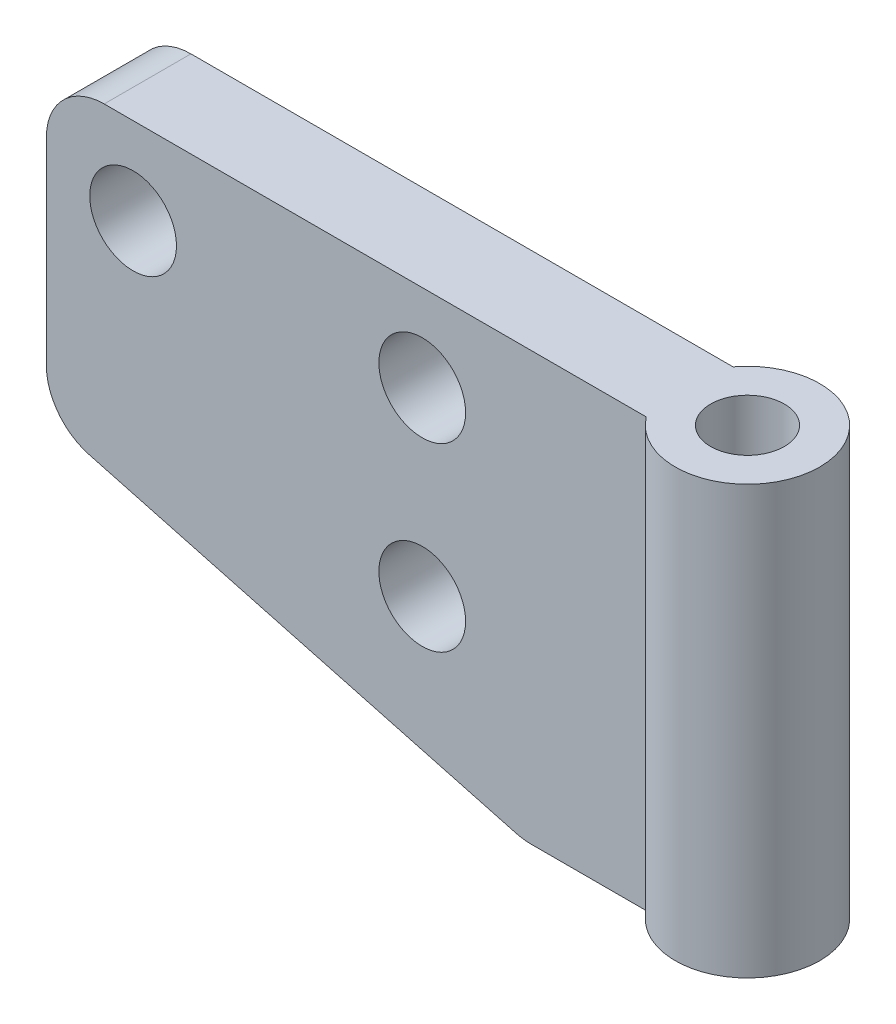
ISO-10303-21;
HEADER;
FILE_DESCRIPTION(('STEP AP214'),'2;1');
FILE_NAME('part.step','',(''),(''),'','','');
FILE_SCHEMA(('AUTOMOTIVE_DESIGN { 1 0 10303 214 1 1 1 1 }'));
ENDSEC;
DATA;
#1=APPLICATION_CONTEXT('core data for automotive mechanical design processes');
#2=APPLICATION_PROTOCOL_DEFINITION('international standard','automotive_design',2000,#1);
#3=PRODUCT_CONTEXT('',#1,'mechanical');
#4=PRODUCT('Part','Part','',(#3));
#5=PRODUCT_RELATED_PRODUCT_CATEGORY('part','',(#4));
#6=PRODUCT_DEFINITION_FORMATION('','',#4);
#7=PRODUCT_DEFINITION_CONTEXT('part definition',#1,'design');
#8=PRODUCT_DEFINITION('design','',#6,#7);
#9=PRODUCT_DEFINITION_SHAPE('','',#8);
#10=(LENGTH_UNIT() NAMED_UNIT(*) SI_UNIT(.MILLI.,.METRE.));
#11=(NAMED_UNIT(*) PLANE_ANGLE_UNIT() SI_UNIT($,.RADIAN.));
#12=(NAMED_UNIT(*) SI_UNIT($,.STERADIAN.) SOLID_ANGLE_UNIT());
#13=UNCERTAINTY_MEASURE_WITH_UNIT(LENGTH_MEASURE(1.E-05),#10,'distance_accuracy_value','');
#14=(GEOMETRIC_REPRESENTATION_CONTEXT(3) GLOBAL_UNCERTAINTY_ASSIGNED_CONTEXT((#13)) GLOBAL_UNIT_ASSIGNED_CONTEXT((#10,
#11,#12)) REPRESENTATION_CONTEXT('',''));
#15=CARTESIAN_POINT('',(0.,0.,0.));
#16=DIRECTION('',(0.,0.,1.));
#17=DIRECTION('',(1.,0.,0.));
#18=AXIS2_PLACEMENT_3D('',#15,#16,#17);
#19=CARTESIAN_POINT('',(27.5266099903496,-19.58,6.));
#20=DIRECTION('',(0.,0.,1.));
#21=DIRECTION('',(1.,0.,0.));
#22=AXIS2_PLACEMENT_3D('',#19,#20,#21);
#23=PLANE('',#22);
#24=DIRECTION('',(0.,1.,0.));
#25=VECTOR('',#24,1.);
#26=CARTESIAN_POINT('',(35.5,-23.58,6.));
#27=LINE('',#26,#25);
#28=CARTESIAN_POINT('',(35.5,6.,6.));
#29=VERTEX_POINT('',#28);
#30=CARTESIAN_POINT('',(35.5,-23.58,6.));
#31=VERTEX_POINT('',#30);
#32=EDGE_CURVE('E216',#29,#31,#27,.F.);
#33=ORIENTED_EDGE('',*,*,#32,.F.);
#34=DIRECTION('',(-1.,0.,0.));
#35=VECTOR('',#34,1.);
#36=CARTESIAN_POINT('',(-1.99999999999997,6.,6.));
#37=LINE('',#36,#35);
#38=CARTESIAN_POINT('',(-1.99999999999997,6.,6.));
#39=VERTEX_POINT('',#38);
#40=EDGE_CURVE('E238',#29,#39,#37,.T.);
#41=ORIENTED_EDGE('',*,*,#40,.T.);
#42=CARTESIAN_POINT('',(-2.,2.,6.));
#43=DIRECTION('',(0.,0.,1.));
#44=DIRECTION('',(1.,0.,0.));
#45=AXIS2_PLACEMENT_3D('',#42,#43,#44);
#46=CIRCLE('',#45,4.);
#47=CARTESIAN_POINT('',(-6.,1.99999999999997,6.));
#48=VERTEX_POINT('',#47);
#49=EDGE_CURVE('E110',#39,#48,#46,.T.);
#50=ORIENTED_EDGE('',*,*,#49,.T.);
#51=DIRECTION('',(0.,-1.,0.));
#52=VECTOR('',#51,1.);
#53=CARTESIAN_POINT('',(-6.,-11.6683686978573,6.));
#54=LINE('',#53,#52);
#55=CARTESIAN_POINT('',(-6.,-11.6683686978573,6.));
#56=VERTEX_POINT('',#55);
#57=EDGE_CURVE('E103',#48,#56,#54,.T.);
#58=ORIENTED_EDGE('',*,*,#57,.T.);
#59=CARTESIAN_POINT('',(-2.,-11.6683686978573,6.));
#60=DIRECTION('',(0.,0.,1.));
#61=DIRECTION('',(-1.,0.,0.));
#62=AXIS2_PLACEMENT_3D('',#59,#60,#61);
#63=CIRCLE('',#62,4.);
#64=CARTESIAN_POINT('',(-3.03527618041006,-15.5320720030136,6.));
#65=VERTEX_POINT('',#64);
#66=EDGE_CURVE('E108',#56,#65,#63,.T.);
#67=ORIENTED_EDGE('',*,*,#66,.T.);
#68=DIRECTION('',(0.96592582628907,-0.258819045102514,0.));
#69=VECTOR('',#68,1.);
#70=CARTESIAN_POINT('',(26.4913338099395,-23.4437033051563,6.));
#71=LINE('',#70,#69);
#72=CARTESIAN_POINT('',(26.4913338099395,-23.4437033051563,6.));
#73=VERTEX_POINT('',#72);
#74=EDGE_CURVE('E55',#65,#73,#71,.T.);
#75=ORIENTED_EDGE('',*,*,#74,.T.);
#76=CARTESIAN_POINT('',(27.5266099903496,-19.58,6.));
#77=DIRECTION('',(0.,0.,1.));
#78=DIRECTION('',(1.,0.,0.));
#79=AXIS2_PLACEMENT_3D('',#76,#77,#78);
#80=CIRCLE('',#79,4.);
#81=CARTESIAN_POINT('',(27.5266099903496,-23.58,6.));
#82=VERTEX_POINT('',#81);
#83=EDGE_CURVE('E142',#73,#82,#80,.T.);
#84=ORIENTED_EDGE('',*,*,#83,.T.);
#85=DIRECTION('',(1.,0.,0.));
#86=VECTOR('',#85,1.);
#87=CARTESIAN_POINT('',(27.5266099903496,-23.58,6.));
#88=LINE('',#87,#86);
#89=EDGE_CURVE('E93',#82,#31,#88,.T.);
#90=ORIENTED_EDGE('',*,*,#89,.T.);
#91=EDGE_LOOP('',(#33,#41,#50,#58,#67,#75,#84,#90));
#92=FACE_BOUND('',#91,.T.);
#93=CARTESIAN_POINT('',(20.,0.,6.));
#94=DIRECTION('',(0.,0.,1.));
#95=DIRECTION('',(1.,0.,0.));
#96=AXIS2_PLACEMENT_3D('',#93,#94,#95);
#97=CIRCLE('',#96,3.);
#98=CARTESIAN_POINT('',(23.,0.,6.));
#99=VERTEX_POINT('',#98);
#100=EDGE_CURVE('E226',#99,#99,#97,.T.);
#101=ORIENTED_EDGE('',*,*,#100,.F.);
#102=EDGE_LOOP('',(#101));
#103=FACE_BOUND('',#102,.T.);
#104=CARTESIAN_POINT('',(0.,0.,6.));
#105=DIRECTION('',(0.,0.,1.));
#106=DIRECTION('',(1.,0.,0.));
#107=AXIS2_PLACEMENT_3D('',#104,#105,#106);
#108=CIRCLE('',#107,3.);
#109=CARTESIAN_POINT('',(3.,0.,6.));
#110=VERTEX_POINT('',#109);
#111=EDGE_CURVE('E132',#110,#110,#108,.T.);
#112=ORIENTED_EDGE('',*,*,#111,.F.);
#113=EDGE_LOOP('',(#112));
#114=FACE_BOUND('',#113,.T.);
#115=CARTESIAN_POINT('',(20.,-12.5,6.));
#116=DIRECTION('',(0.,0.,1.));
#117=DIRECTION('',(1.,0.,0.));
#118=AXIS2_PLACEMENT_3D('',#115,#116,#117);
#119=CIRCLE('',#118,3.);
#120=CARTESIAN_POINT('',(23.,-12.5,6.));
#121=VERTEX_POINT('',#120);
#122=EDGE_CURVE('E220',#121,#121,#119,.T.);
#123=ORIENTED_EDGE('',*,*,#122,.F.);
#124=EDGE_LOOP('',(#123));
#125=FACE_BOUND('',#124,.T.);
#126=ADVANCED_FACE('F38',(#92,#103,#114,#125),#23,.T.);
#127=CARTESIAN_POINT('',(27.5266099903496,-19.58,0.));
#128=DIRECTION('',(0.,0.,1.));
#129=DIRECTION('',(1.,0.,0.));
#130=AXIS2_PLACEMENT_3D('',#127,#128,#129);
#131=PLANE('',#130);
#132=DIRECTION('',(-1.,0.,0.));
#133=VECTOR('',#132,1.);
#134=CARTESIAN_POINT('',(-1.99999999999997,6.,0.));
#135=LINE('',#134,#133);
#136=CARTESIAN_POINT('',(35.5,6.,0.));
#137=VERTEX_POINT('',#136);
#138=CARTESIAN_POINT('',(-1.99999999999997,6.,0.));
#139=VERTEX_POINT('',#138);
#140=EDGE_CURVE('E135',#137,#139,#135,.T.);
#141=ORIENTED_EDGE('',*,*,#140,.F.);
#142=DIRECTION('',(0.,1.,0.));
#143=VECTOR('',#142,1.);
#144=CARTESIAN_POINT('',(35.5,-23.58,0.));
#145=LINE('',#144,#143);
#146=CARTESIAN_POINT('',(35.5,-23.58,0.));
#147=VERTEX_POINT('',#146);
#148=EDGE_CURVE('E212',#137,#147,#145,.F.);
#149=ORIENTED_EDGE('',*,*,#148,.T.);
#150=DIRECTION('',(1.,0.,0.));
#151=VECTOR('',#150,1.);
#152=CARTESIAN_POINT('',(27.5266099903496,-23.58,0.));
#153=LINE('',#152,#151);
#154=CARTESIAN_POINT('',(27.5266099903496,-23.58,0.));
#155=VERTEX_POINT('',#154);
#156=EDGE_CURVE('E131',#155,#147,#153,.T.);
#157=ORIENTED_EDGE('',*,*,#156,.F.);
#158=CARTESIAN_POINT('',(27.5266099903496,-19.58,0.));
#159=DIRECTION('',(0.,0.,1.));
#160=DIRECTION('',(1.,0.,0.));
#161=AXIS2_PLACEMENT_3D('',#158,#159,#160);
#162=CIRCLE('',#161,4.);
#163=CARTESIAN_POINT('',(26.4913338099395,-23.4437033051563,0.));
#164=VERTEX_POINT('',#163);
#165=EDGE_CURVE('E128',#164,#155,#162,.T.);
#166=ORIENTED_EDGE('',*,*,#165,.F.);
#167=DIRECTION('',(0.96592582628907,-0.258819045102514,0.));
#168=VECTOR('',#167,1.);
#169=CARTESIAN_POINT('',(26.4913338099395,-23.4437033051563,0.));
#170=LINE('',#169,#168);
#171=CARTESIAN_POINT('',(-3.03527618041006,-15.5320720030136,0.));
#172=VERTEX_POINT('',#171);
#173=EDGE_CURVE('E85',#172,#164,#170,.T.);
#174=ORIENTED_EDGE('',*,*,#173,.F.);
#175=CARTESIAN_POINT('',(-2.,-11.6683686978573,0.));
#176=DIRECTION('',(0.,0.,1.));
#177=DIRECTION('',(-1.,0.,0.));
#178=AXIS2_PLACEMENT_3D('',#175,#176,#177);
#179=CIRCLE('',#178,4.);
#180=CARTESIAN_POINT('',(-6.,-11.6683686978573,0.));
#181=VERTEX_POINT('',#180);
#182=EDGE_CURVE('E79',#181,#172,#179,.T.);
#183=ORIENTED_EDGE('',*,*,#182,.F.);
#184=DIRECTION('',(0.,-1.,0.));
#185=VECTOR('',#184,1.);
#186=CARTESIAN_POINT('',(-6.,-11.6683686978573,0.));
#187=LINE('',#186,#185);
#188=CARTESIAN_POINT('',(-6.,1.99999999999997,0.));
#189=VERTEX_POINT('',#188);
#190=EDGE_CURVE('E118',#189,#181,#187,.T.);
#191=ORIENTED_EDGE('',*,*,#190,.F.);
#192=CARTESIAN_POINT('',(-2.,2.,0.));
#193=DIRECTION('',(0.,0.,1.));
#194=DIRECTION('',(1.,0.,0.));
#195=AXIS2_PLACEMENT_3D('',#192,#193,#194);
#196=CIRCLE('',#195,4.);
#197=EDGE_CURVE('E137',#139,#189,#196,.T.);
#198=ORIENTED_EDGE('',*,*,#197,.F.);
#199=EDGE_LOOP('',(#141,#149,#157,#166,#174,#183,#191,#198));
#200=FACE_BOUND('',#199,.T.);
#201=CARTESIAN_POINT('',(0.,0.,0.));
#202=DIRECTION('',(0.,0.,1.));
#203=DIRECTION('',(1.,0.,0.));
#204=AXIS2_PLACEMENT_3D('',#201,#202,#203);
#205=CIRCLE('',#204,3.);
#206=CARTESIAN_POINT('',(3.,0.,0.));
#207=VERTEX_POINT('',#206);
#208=EDGE_CURVE('E229',#207,#207,#205,.T.);
#209=ORIENTED_EDGE('',*,*,#208,.T.);
#210=EDGE_LOOP('',(#209));
#211=FACE_BOUND('',#210,.T.);
#212=CARTESIAN_POINT('',(20.,0.,0.));
#213=DIRECTION('',(0.,0.,1.));
#214=DIRECTION('',(1.,0.,0.));
#215=AXIS2_PLACEMENT_3D('',#212,#213,#214);
#216=CIRCLE('',#215,3.);
#217=CARTESIAN_POINT('',(23.,0.,0.));
#218=VERTEX_POINT('',#217);
#219=EDGE_CURVE('E223',#218,#218,#216,.T.);
#220=ORIENTED_EDGE('',*,*,#219,.T.);
#221=EDGE_LOOP('',(#220));
#222=FACE_BOUND('',#221,.T.);
#223=CARTESIAN_POINT('',(20.,-12.5,0.));
#224=DIRECTION('',(0.,0.,1.));
#225=DIRECTION('',(1.,0.,0.));
#226=AXIS2_PLACEMENT_3D('',#223,#224,#225);
#227=CIRCLE('',#226,3.);
#228=CARTESIAN_POINT('',(23.,-12.5,0.));
#229=VERTEX_POINT('',#228);
#230=EDGE_CURVE('E219',#229,#229,#227,.T.);
#231=ORIENTED_EDGE('',*,*,#230,.T.);
#232=EDGE_LOOP('',(#231));
#233=FACE_BOUND('',#232,.T.);
#234=ADVANCED_FACE('F154',(#200,#211,#222,#233),#131,.F.);
#235=CARTESIAN_POINT('',(27.5266099903496,-19.58,6.));
#236=DIRECTION('',(0.,0.,-1.));
#237=DIRECTION('',(-1.,0.,0.));
#238=AXIS2_PLACEMENT_3D('',#235,#236,#237);
#239=CYLINDRICAL_SURFACE('',#238,4.);
#240=ORIENTED_EDGE('',*,*,#165,.T.);
#241=DIRECTION('',(0.,0.,-1.));
#242=VECTOR('',#241,1.);
#243=CARTESIAN_POINT('',(27.5266099903496,-23.58,6.));
#244=LINE('',#243,#242);
#245=EDGE_CURVE('E11',#82,#155,#244,.T.);
#246=ORIENTED_EDGE('',*,*,#245,.F.);
#247=ORIENTED_EDGE('',*,*,#83,.F.);
#248=DIRECTION('',(0.,0.,-1.));
#249=VECTOR('',#248,1.);
#250=CARTESIAN_POINT('',(26.4913338099395,-23.4437033051563,6.));
#251=LINE('',#250,#249);
#252=EDGE_CURVE('E124',#73,#164,#251,.T.);
#253=ORIENTED_EDGE('',*,*,#252,.T.);
#254=EDGE_LOOP('',(#240,#246,#247,#253));
#255=FACE_BOUND('',#254,.T.);
#256=ADVANCED_FACE('F40',(#255),#239,.T.);
#257=CARTESIAN_POINT('',(27.5266099903496,-23.58,6.));
#258=DIRECTION('',(0.,1.,0.));
#259=DIRECTION('',(0.,0.,1.));
#260=AXIS2_PLACEMENT_3D('',#257,#258,#259);
#261=PLANE('',#260);
#262=CARTESIAN_POINT('',(39.5,-23.58,3.));
#263=DIRECTION('',(0.,1.,0.));
#264=DIRECTION('',(0.,0.,1.));
#265=AXIS2_PLACEMENT_3D('',#262,#263,#264);
#266=CIRCLE('',#265,2.55);
#267=CARTESIAN_POINT('',(39.5,-23.58,5.55));
#268=VERTEX_POINT('',#267);
#269=EDGE_CURVE('E200',#268,#268,#266,.T.);
#270=ORIENTED_EDGE('',*,*,#269,.T.);
#271=EDGE_LOOP('',(#270));
#272=FACE_BOUND('',#271,.T.);
#273=CARTESIAN_POINT('',(39.5,-23.58,3.));
#274=DIRECTION('',(0.,1.,0.));
#275=DIRECTION('',(0.,0.,1.));
#276=AXIS2_PLACEMENT_3D('',#273,#274,#275);
#277=CIRCLE('',#276,5.);
#278=EDGE_CURVE('E209',#31,#147,#277,.T.);
#279=ORIENTED_EDGE('',*,*,#278,.F.);
#280=ORIENTED_EDGE('',*,*,#89,.F.);
#281=ORIENTED_EDGE('',*,*,#245,.T.);
#282=ORIENTED_EDGE('',*,*,#156,.T.);
#283=EDGE_LOOP('',(#279,#280,#281,#282));
#284=FACE_BOUND('',#283,.T.);
#285=ADVANCED_FACE('F246',(#272,#284),#261,.F.);
#286=CARTESIAN_POINT('',(-1.99999999999997,6.,6.));
#287=DIRECTION('',(0.,-1.,0.));
#288=DIRECTION('',(0.,0.,-1.));
#289=AXIS2_PLACEMENT_3D('',#286,#287,#288);
#290=PLANE('',#289);
#291=CARTESIAN_POINT('',(39.5,6.,3.));
#292=DIRECTION('',(0.,1.,0.));
#293=DIRECTION('',(0.,0.,1.));
#294=AXIS2_PLACEMENT_3D('',#291,#292,#293);
#295=CIRCLE('',#294,2.55);
#296=CARTESIAN_POINT('',(39.5,6.,5.55));
#297=VERTEX_POINT('',#296);
#298=EDGE_CURVE('E203',#297,#297,#295,.T.);
#299=ORIENTED_EDGE('',*,*,#298,.F.);
#300=EDGE_LOOP('',(#299));
#301=FACE_BOUND('',#300,.T.);
#302=ORIENTED_EDGE('',*,*,#40,.F.);
#303=CARTESIAN_POINT('',(39.5,6.,3.));
#304=DIRECTION('',(0.,1.,0.));
#305=DIRECTION('',(0.,0.,1.));
#306=AXIS2_PLACEMENT_3D('',#303,#304,#305);
#307=CIRCLE('',#306,5.);
#308=EDGE_CURVE('E206',#29,#137,#307,.T.);
#309=ORIENTED_EDGE('',*,*,#308,.T.);
#310=ORIENTED_EDGE('',*,*,#140,.T.);
#311=DIRECTION('',(0.,0.,-1.));
#312=VECTOR('',#311,1.);
#313=CARTESIAN_POINT('',(-1.99999999999997,6.,6.));
#314=LINE('',#313,#312);
#315=EDGE_CURVE('E47',#39,#139,#314,.T.);
#316=ORIENTED_EDGE('',*,*,#315,.F.);
#317=EDGE_LOOP('',(#302,#309,#310,#316));
#318=FACE_BOUND('',#317,.T.);
#319=ADVANCED_FACE('F239',(#301,#318),#290,.F.);
#320=CARTESIAN_POINT('',(-2.,2.,6.));
#321=DIRECTION('',(0.,0.,-1.));
#322=DIRECTION('',(-1.,0.,0.));
#323=AXIS2_PLACEMENT_3D('',#320,#321,#322);
#324=CYLINDRICAL_SURFACE('',#323,4.);
#325=ORIENTED_EDGE('',*,*,#197,.T.);
#326=DIRECTION('',(0.,0.,-1.));
#327=VECTOR('',#326,1.);
#328=CARTESIAN_POINT('',(-6.,1.99999999999997,6.));
#329=LINE('',#328,#327);
#330=EDGE_CURVE('E119',#48,#189,#329,.T.);
#331=ORIENTED_EDGE('',*,*,#330,.F.);
#332=ORIENTED_EDGE('',*,*,#49,.F.);
#333=ORIENTED_EDGE('',*,*,#315,.T.);
#334=EDGE_LOOP('',(#325,#331,#332,#333));
#335=FACE_BOUND('',#334,.T.);
#336=ADVANCED_FACE('F149',(#335),#324,.T.);
#337=CARTESIAN_POINT('',(-6.,-11.6683686978573,6.));
#338=DIRECTION('',(1.,0.,0.));
#339=DIRECTION('',(0.,1.,0.));
#340=AXIS2_PLACEMENT_3D('',#337,#338,#339);
#341=PLANE('',#340);
#342=ORIENTED_EDGE('',*,*,#190,.T.);
#343=DIRECTION('',(0.,0.,-1.));
#344=VECTOR('',#343,1.);
#345=CARTESIAN_POINT('',(-6.,-11.6683686978573,6.));
#346=LINE('',#345,#344);
#347=EDGE_CURVE('E115',#56,#181,#346,.T.);
#348=ORIENTED_EDGE('',*,*,#347,.F.);
#349=ORIENTED_EDGE('',*,*,#57,.F.);
#350=ORIENTED_EDGE('',*,*,#330,.T.);
#351=EDGE_LOOP('',(#342,#348,#349,#350));
#352=FACE_BOUND('',#351,.T.);
#353=ADVANCED_FACE('F116',(#352),#341,.F.);
#354=CARTESIAN_POINT('',(-2.,-11.6683686978573,6.));
#355=DIRECTION('',(0.,0.,-1.));
#356=DIRECTION('',(-1.,0.,0.));
#357=AXIS2_PLACEMENT_3D('',#354,#355,#356);
#358=CYLINDRICAL_SURFACE('',#357,4.);
#359=ORIENTED_EDGE('',*,*,#182,.T.);
#360=DIRECTION('',(0.,0.,-1.));
#361=VECTOR('',#360,1.);
#362=CARTESIAN_POINT('',(-3.03527618041006,-15.5320720030136,6.));
#363=LINE('',#362,#361);
#364=EDGE_CURVE('E120',#65,#172,#363,.T.);
#365=ORIENTED_EDGE('',*,*,#364,.F.);
#366=ORIENTED_EDGE('',*,*,#66,.F.);
#367=ORIENTED_EDGE('',*,*,#347,.T.);
#368=EDGE_LOOP('',(#359,#365,#366,#367));
#369=FACE_BOUND('',#368,.T.);
#370=ADVANCED_FACE('F122',(#369),#358,.T.);
#371=CARTESIAN_POINT('',(26.4913338099395,-23.4437033051563,6.));
#372=DIRECTION('',(0.258819045102514,0.96592582628907,0.));
#373=DIRECTION('',(-0.96592582628907,0.258819045102514,0.));
#374=AXIS2_PLACEMENT_3D('',#371,#372,#373);
#375=PLANE('',#374);
#376=ORIENTED_EDGE('',*,*,#173,.T.);
#377=ORIENTED_EDGE('',*,*,#252,.F.);
#378=ORIENTED_EDGE('',*,*,#74,.F.);
#379=ORIENTED_EDGE('',*,*,#364,.T.);
#380=EDGE_LOOP('',(#376,#377,#378,#379));
#381=FACE_BOUND('',#380,.T.);
#382=ADVANCED_FACE('F162',(#381),#375,.F.);
#383=CARTESIAN_POINT('',(0.,0.,6.));
#384=DIRECTION('',(0.,0.,-1.));
#385=DIRECTION('',(-1.,0.,0.));
#386=AXIS2_PLACEMENT_3D('',#383,#384,#385);
#387=CYLINDRICAL_SURFACE('',#386,3.);
#388=ORIENTED_EDGE('',*,*,#111,.T.);
#389=EDGE_LOOP('',(#388));
#390=FACE_BOUND('',#389,.T.);
#391=ORIENTED_EDGE('',*,*,#208,.F.);
#392=EDGE_LOOP('',(#391));
#393=FACE_BOUND('',#392,.T.);
#394=ADVANCED_FACE('F164',(#390,#393),#387,.F.);
#395=CARTESIAN_POINT('',(20.,0.,6.));
#396=DIRECTION('',(0.,0.,-1.));
#397=DIRECTION('',(-1.,0.,0.));
#398=AXIS2_PLACEMENT_3D('',#395,#396,#397);
#399=CYLINDRICAL_SURFACE('',#398,3.);
#400=ORIENTED_EDGE('',*,*,#100,.T.);
#401=EDGE_LOOP('',(#400));
#402=FACE_BOUND('',#401,.T.);
#403=ORIENTED_EDGE('',*,*,#219,.F.);
#404=EDGE_LOOP('',(#403));
#405=FACE_BOUND('',#404,.T.);
#406=ADVANCED_FACE('F170',(#402,#405),#399,.F.);
#407=CARTESIAN_POINT('',(20.,-12.5,6.));
#408=DIRECTION('',(0.,0.,-1.));
#409=DIRECTION('',(-1.,0.,0.));
#410=AXIS2_PLACEMENT_3D('',#407,#408,#409);
#411=CYLINDRICAL_SURFACE('',#410,3.);
#412=ORIENTED_EDGE('',*,*,#122,.T.);
#413=EDGE_LOOP('',(#412));
#414=FACE_BOUND('',#413,.T.);
#415=ORIENTED_EDGE('',*,*,#230,.F.);
#416=EDGE_LOOP('',(#415));
#417=FACE_BOUND('',#416,.T.);
#418=ADVANCED_FACE('F183',(#414,#417),#411,.F.);
#419=CARTESIAN_POINT('',(39.5,-23.58,3.));
#420=DIRECTION('',(0.,1.,0.));
#421=DIRECTION('',(0.,0.,1.));
#422=AXIS2_PLACEMENT_3D('',#419,#420,#421);
#423=CYLINDRICAL_SURFACE('',#422,5.);
#424=ORIENTED_EDGE('',*,*,#308,.F.);
#425=ORIENTED_EDGE('',*,*,#32,.T.);
#426=ORIENTED_EDGE('',*,*,#278,.T.);
#427=ORIENTED_EDGE('',*,*,#148,.F.);
#428=EDGE_LOOP('',(#424,#425,#426,#427));
#429=FACE_BOUND('',#428,.T.);
#430=ADVANCED_FACE('F187',(#429),#423,.T.);
#431=CARTESIAN_POINT('',(39.5,-23.58,3.));
#432=DIRECTION('',(0.,1.,0.));
#433=DIRECTION('',(0.,0.,1.));
#434=AXIS2_PLACEMENT_3D('',#431,#432,#433);
#435=CYLINDRICAL_SURFACE('',#434,2.55);
#436=ORIENTED_EDGE('',*,*,#269,.F.);
#437=EDGE_LOOP('',(#436));
#438=FACE_BOUND('',#437,.T.);
#439=ORIENTED_EDGE('',*,*,#298,.T.);
#440=EDGE_LOOP('',(#439));
#441=FACE_BOUND('',#440,.T.);
#442=ADVANCED_FACE('F191',(#438,#441),#435,.F.);
#443=CLOSED_SHELL('',(#126,#234,#256,#285,#319,#336,#353,#370,#382,#394,#406,#418,#430,#442));
#444=MANIFOLD_SOLID_BREP('B2',#443);
#445=ADVANCED_BREP_SHAPE_REPRESENTATION('',(#18,#444),#14);
#446=SHAPE_DEFINITION_REPRESENTATION(#9,#445);
ENDSEC;
END-ISO-10303-21;
